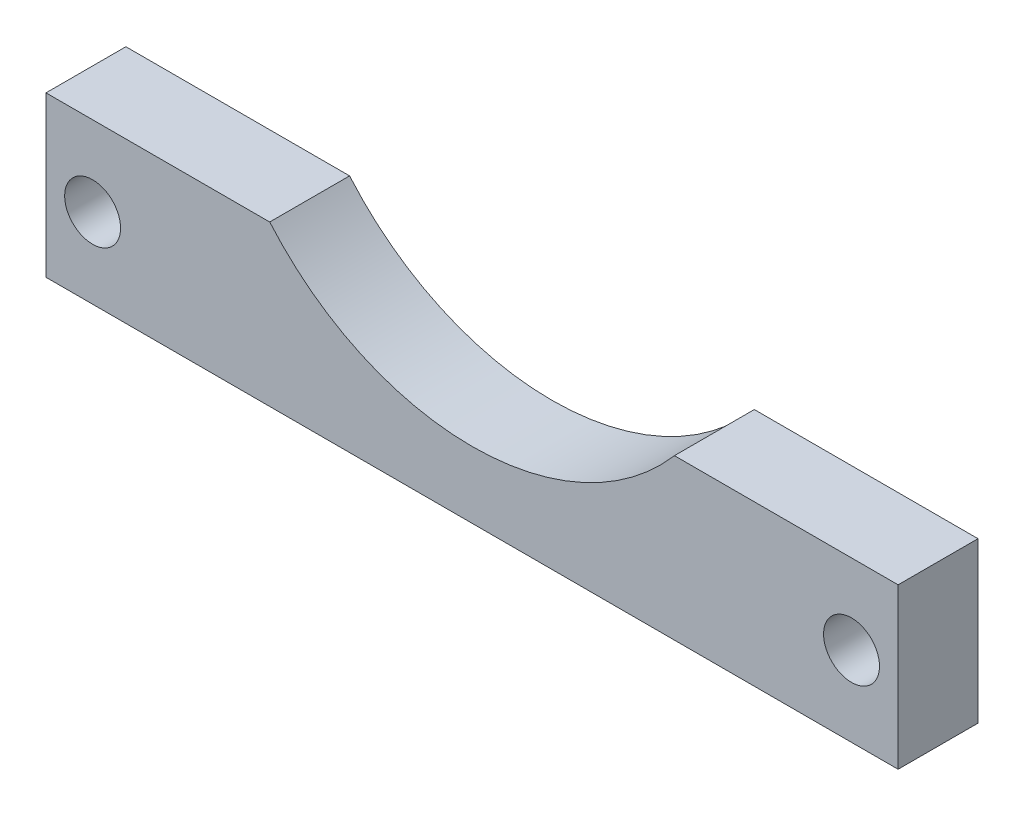
ISO-10303-21;
HEADER;
FILE_DESCRIPTION(('STEP AP214'),'2;1');
FILE_NAME('part.step','',(''),(''),'','','');
FILE_SCHEMA(('AUTOMOTIVE_DESIGN { 1 0 10303 214 1 1 1 1 }'));
ENDSEC;
DATA;
#1=APPLICATION_CONTEXT('core data for automotive mechanical design processes');
#2=APPLICATION_PROTOCOL_DEFINITION('international standard','automotive_design',2000,#1);
#3=PRODUCT_CONTEXT('',#1,'mechanical');
#4=PRODUCT('Part','Part','',(#3));
#5=PRODUCT_RELATED_PRODUCT_CATEGORY('part','',(#4));
#6=PRODUCT_DEFINITION_FORMATION('','',#4);
#7=PRODUCT_DEFINITION_CONTEXT('part definition',#1,'design');
#8=PRODUCT_DEFINITION('design','',#6,#7);
#9=PRODUCT_DEFINITION_SHAPE('','',#8);
#10=(LENGTH_UNIT() NAMED_UNIT(*) SI_UNIT(.MILLI.,.METRE.));
#11=(NAMED_UNIT(*) PLANE_ANGLE_UNIT() SI_UNIT($,.RADIAN.));
#12=(NAMED_UNIT(*) SI_UNIT($,.STERADIAN.) SOLID_ANGLE_UNIT());
#13=UNCERTAINTY_MEASURE_WITH_UNIT(LENGTH_MEASURE(1.E-05),#10,'distance_accuracy_value','');
#14=(GEOMETRIC_REPRESENTATION_CONTEXT(3) GLOBAL_UNCERTAINTY_ASSIGNED_CONTEXT((#13)) GLOBAL_UNIT_ASSIGNED_CONTEXT((#10,
#11,#12)) REPRESENTATION_CONTEXT('',''));
#15=CARTESIAN_POINT('',(0.,0.,0.));
#16=DIRECTION('',(0.,0.,1.));
#17=DIRECTION('',(1.,0.,0.));
#18=AXIS2_PLACEMENT_3D('',#15,#16,#17);
#19=CARTESIAN_POINT('',(-23.6048186104263,5.70389344262295,3.));
#20=DIRECTION('',(0.,1.,0.));
#21=DIRECTION('',(-1.,0.,0.));
#22=AXIS2_PLACEMENT_3D('',#19,#20,#21);
#23=PLANE('',#22);
#24=DIRECTION('',(1.,0.,0.));
#25=VECTOR('',#24,1.);
#26=CARTESIAN_POINT('',(-23.6048186104263,5.70389344262295,0.));
#27=LINE('',#26,#25);
#28=CARTESIAN_POINT('',(-0.00547653364095426,5.70389344262296,0.));
#29=VERTEX_POINT('',#28);
#30=CARTESIAN_POINT('',(8.3951813895737,5.70389344262296,0.));
#31=VERTEX_POINT('',#30);
#32=EDGE_CURVE('E111',#29,#31,#27,.T.);
#33=ORIENTED_EDGE('',*,*,#32,.F.);
#34=DIRECTION('',(0.,0.,-1.));
#35=VECTOR('',#34,1.);
#36=CARTESIAN_POINT('',(-0.00547653364095426,5.70389344262296,19.));
#37=LINE('',#36,#35);
#38=CARTESIAN_POINT('',(-0.00547653364095426,5.70389344262296,3.));
#39=VERTEX_POINT('',#38);
#40=EDGE_CURVE('E48',#39,#29,#37,.T.);
#41=ORIENTED_EDGE('',*,*,#40,.F.);
#42=DIRECTION('',(1.,0.,0.));
#43=VECTOR('',#42,1.);
#44=CARTESIAN_POINT('',(-23.6048186104263,5.70389344262295,3.));
#45=LINE('',#44,#43);
#46=CARTESIAN_POINT('',(8.3951813895737,5.70389344262296,3.));
#47=VERTEX_POINT('',#46);
#48=EDGE_CURVE('E135',#39,#47,#45,.T.);
#49=ORIENTED_EDGE('',*,*,#48,.T.);
#50=DIRECTION('',(0.,0.,-1.));
#51=VECTOR('',#50,1.);
#52=CARTESIAN_POINT('',(8.3951813895737,5.70389344262296,3.));
#53=LINE('',#52,#51);
#54=EDGE_CURVE('E119',#47,#31,#53,.T.);
#55=ORIENTED_EDGE('',*,*,#54,.T.);
#56=EDGE_LOOP('',(#33,#41,#49,#55));
#57=FACE_BOUND('',#56,.T.);
#58=ADVANCED_FACE('F33',(#57),#23,.T.);
#59=CARTESIAN_POINT('',(-23.6048186104263,5.70389344262295,3.));
#60=VERTEX_POINT('',#59);
#61=CARTESIAN_POINT('',(-15.2041606872116,5.70389344262295,3.));
#62=VERTEX_POINT('',#61);
#63=EDGE_CURVE('E104',#60,#62,#45,.T.);
#64=ORIENTED_EDGE('',*,*,#63,.T.);
#65=DIRECTION('',(0.,0.,-1.));
#66=VECTOR('',#65,1.);
#67=CARTESIAN_POINT('',(-15.2041606872116,5.70389344262295,19.));
#68=LINE('',#67,#66);
#69=CARTESIAN_POINT('',(-15.2041606872116,5.70389344262295,0.));
#70=VERTEX_POINT('',#69);
#71=EDGE_CURVE('E94',#62,#70,#68,.T.);
#72=ORIENTED_EDGE('',*,*,#71,.T.);
#73=CARTESIAN_POINT('',(-23.6048186104263,5.70389344262295,0.));
#74=VERTEX_POINT('',#73);
#75=EDGE_CURVE('E102',#74,#70,#27,.T.);
#76=ORIENTED_EDGE('',*,*,#75,.F.);
#77=DIRECTION('',(0.,0.,-1.));
#78=VECTOR('',#77,1.);
#79=CARTESIAN_POINT('',(-23.6048186104263,5.70389344262295,3.));
#80=LINE('',#79,#78);
#81=EDGE_CURVE('E57',#60,#74,#80,.T.);
#82=ORIENTED_EDGE('',*,*,#81,.F.);
#83=EDGE_LOOP('',(#64,#72,#76,#82));
#84=FACE_BOUND('',#83,.T.);
#85=ADVANCED_FACE('F101',(#84),#23,.T.);
#86=CARTESIAN_POINT('',(0.,0.,3.));
#87=DIRECTION('',(0.,0.,1.));
#88=DIRECTION('',(1.,0.,0.));
#89=AXIS2_PLACEMENT_3D('',#86,#87,#88);
#90=PLANE('',#89);
#91=CARTESIAN_POINT('',(6.64518138957371,2.70389344262296,3.));
#92=DIRECTION('',(0.,0.,1.));
#93=DIRECTION('',(1.,0.,0.));
#94=AXIS2_PLACEMENT_3D('',#91,#92,#93);
#95=CIRCLE('',#94,1.05);
#96=CARTESIAN_POINT('',(7.69518138957371,2.70389344262296,3.));
#97=VERTEX_POINT('',#96);
#98=EDGE_CURVE('E145',#97,#97,#95,.F.);
#99=ORIENTED_EDGE('',*,*,#98,.T.);
#100=EDGE_LOOP('',(#99));
#101=FACE_BOUND('',#100,.T.);
#102=ORIENTED_EDGE('',*,*,#48,.F.);
#103=CARTESIAN_POINT('',(-7.60481861042629,12.203893442623,3.));
#104=DIRECTION('',(0.,0.,1.));
#105=DIRECTION('',(1.,0.,0.));
#106=AXIS2_PLACEMENT_3D('',#103,#104,#105);
#107=CIRCLE('',#106,10.);
#108=EDGE_CURVE('E105',#39,#62,#107,.F.);
#109=ORIENTED_EDGE('',*,*,#108,.T.);
#110=ORIENTED_EDGE('',*,*,#63,.F.);
#111=DIRECTION('',(0.,-1.,0.));
#112=VECTOR('',#111,1.);
#113=CARTESIAN_POINT('',(-23.6048186104263,5.70389344262295,3.));
#114=LINE('',#113,#112);
#115=CARTESIAN_POINT('',(-23.6048186104263,-0.296106557377048,3.));
#116=VERTEX_POINT('',#115);
#117=EDGE_CURVE('E110',#60,#116,#114,.T.);
#118=ORIENTED_EDGE('',*,*,#117,.T.);
#119=DIRECTION('',(1.,0.,0.));
#120=VECTOR('',#119,1.);
#121=CARTESIAN_POINT('',(-23.6048186104263,-0.296106557377048,3.));
#122=LINE('',#121,#120);
#123=CARTESIAN_POINT('',(8.39518138957371,-0.296106557377044,3.));
#124=VERTEX_POINT('',#123);
#125=EDGE_CURVE('E83',#116,#124,#122,.T.);
#126=ORIENTED_EDGE('',*,*,#125,.T.);
#127=DIRECTION('',(0.,-1.,0.));
#128=VECTOR('',#127,1.);
#129=CARTESIAN_POINT('',(8.3951813895737,5.70389344262296,3.));
#130=LINE('',#129,#128);
#131=EDGE_CURVE('E129',#47,#124,#130,.T.);
#132=ORIENTED_EDGE('',*,*,#131,.F.);
#133=EDGE_LOOP('',(#102,#109,#110,#118,#126,#132));
#134=FACE_BOUND('',#133,.T.);
#135=CARTESIAN_POINT('',(-21.8548186104263,2.70389344262295,3.));
#136=DIRECTION('',(0.,0.,1.));
#137=DIRECTION('',(1.,0.,0.));
#138=AXIS2_PLACEMENT_3D('',#135,#136,#137);
#139=CIRCLE('',#138,1.05);
#140=CARTESIAN_POINT('',(-20.8048186104263,2.70389344262295,3.));
#141=VERTEX_POINT('',#140);
#142=EDGE_CURVE('E143',#141,#141,#139,.T.);
#143=ORIENTED_EDGE('',*,*,#142,.F.);
#144=EDGE_LOOP('',(#143));
#145=FACE_BOUND('',#144,.T.);
#146=ADVANCED_FACE('F137',(#101,#134,#145),#90,.T.);
#147=CARTESIAN_POINT('',(0.,0.,0.));
#148=DIRECTION('',(0.,0.,1.));
#149=DIRECTION('',(1.,0.,0.));
#150=AXIS2_PLACEMENT_3D('',#147,#148,#149);
#151=PLANE('',#150);
#152=CARTESIAN_POINT('',(-7.60481861042629,12.203893442623,0.));
#153=DIRECTION('',(0.,0.,1.));
#154=DIRECTION('',(1.,0.,0.));
#155=AXIS2_PLACEMENT_3D('',#152,#153,#154);
#156=CIRCLE('',#155,10.);
#157=EDGE_CURVE('E91',#70,#29,#156,.T.);
#158=ORIENTED_EDGE('',*,*,#157,.T.);
#159=ORIENTED_EDGE('',*,*,#32,.T.);
#160=DIRECTION('',(0.,-1.,0.));
#161=VECTOR('',#160,1.);
#162=CARTESIAN_POINT('',(8.3951813895737,5.70389344262296,0.));
#163=LINE('',#162,#161);
#164=CARTESIAN_POINT('',(8.39518138957371,-0.296106557377044,0.));
#165=VERTEX_POINT('',#164);
#166=EDGE_CURVE('E114',#31,#165,#163,.T.);
#167=ORIENTED_EDGE('',*,*,#166,.T.);
#168=DIRECTION('',(1.,0.,0.));
#169=VECTOR('',#168,1.);
#170=CARTESIAN_POINT('',(-23.6048186104263,-0.296106557377048,0.));
#171=LINE('',#170,#169);
#172=CARTESIAN_POINT('',(-23.6048186104263,-0.296106557377048,0.));
#173=VERTEX_POINT('',#172);
#174=EDGE_CURVE('E130',#173,#165,#171,.T.);
#175=ORIENTED_EDGE('',*,*,#174,.F.);
#176=DIRECTION('',(0.,-1.,0.));
#177=VECTOR('',#176,1.);
#178=CARTESIAN_POINT('',(-23.6048186104263,5.70389344262295,0.));
#179=LINE('',#178,#177);
#180=EDGE_CURVE('E109',#74,#173,#179,.T.);
#181=ORIENTED_EDGE('',*,*,#180,.F.);
#182=ORIENTED_EDGE('',*,*,#75,.T.);
#183=EDGE_LOOP('',(#158,#159,#167,#175,#181,#182));
#184=FACE_BOUND('',#183,.T.);
#185=CARTESIAN_POINT('',(6.64518138957371,2.70389344262296,0.));
#186=DIRECTION('',(0.,0.,1.));
#187=DIRECTION('',(1.,0.,0.));
#188=AXIS2_PLACEMENT_3D('',#185,#186,#187);
#189=CIRCLE('',#188,1.05);
#190=CARTESIAN_POINT('',(7.69518138957371,2.70389344262296,0.));
#191=VERTEX_POINT('',#190);
#192=EDGE_CURVE('E99',#191,#191,#189,.T.);
#193=ORIENTED_EDGE('',*,*,#192,.T.);
#194=EDGE_LOOP('',(#193));
#195=FACE_BOUND('',#194,.T.);
#196=CARTESIAN_POINT('',(-21.8548186104263,2.70389344262295,0.));
#197=DIRECTION('',(0.,0.,-1.));
#198=DIRECTION('',(-1.,0.,0.));
#199=AXIS2_PLACEMENT_3D('',#196,#197,#198);
#200=CIRCLE('',#199,1.05);
#201=CARTESIAN_POINT('',(-22.9048186104263,2.70389344262295,0.));
#202=VERTEX_POINT('',#201);
#203=EDGE_CURVE('E154',#202,#202,#200,.T.);
#204=ORIENTED_EDGE('',*,*,#203,.F.);
#205=EDGE_LOOP('',(#204));
#206=FACE_BOUND('',#205,.T.);
#207=ADVANCED_FACE('F107',(#184,#195,#206),#151,.F.);
#208=CARTESIAN_POINT('',(-23.6048186104263,5.70389344262295,3.));
#209=DIRECTION('',(1.,0.,0.));
#210=DIRECTION('',(0.,0.,-1.));
#211=AXIS2_PLACEMENT_3D('',#208,#209,#210);
#212=PLANE('',#211);
#213=ORIENTED_EDGE('',*,*,#180,.T.);
#214=DIRECTION('',(0.,0.,-1.));
#215=VECTOR('',#214,1.);
#216=CARTESIAN_POINT('',(-23.6048186104263,-0.296106557377048,3.));
#217=LINE('',#216,#215);
#218=EDGE_CURVE('E11',#116,#173,#217,.T.);
#219=ORIENTED_EDGE('',*,*,#218,.F.);
#220=ORIENTED_EDGE('',*,*,#117,.F.);
#221=ORIENTED_EDGE('',*,*,#81,.T.);
#222=EDGE_LOOP('',(#213,#219,#220,#221));
#223=FACE_BOUND('',#222,.T.);
#224=ADVANCED_FACE('F35',(#223),#212,.F.);
#225=CARTESIAN_POINT('',(-23.6048186104263,-0.296106557377048,3.));
#226=DIRECTION('',(0.,1.,0.));
#227=DIRECTION('',(-1.,0.,0.));
#228=AXIS2_PLACEMENT_3D('',#225,#226,#227);
#229=PLANE('',#228);
#230=ORIENTED_EDGE('',*,*,#174,.T.);
#231=DIRECTION('',(0.,0.,-1.));
#232=VECTOR('',#231,1.);
#233=CARTESIAN_POINT('',(8.39518138957371,-0.296106557377044,3.));
#234=LINE('',#233,#232);
#235=EDGE_CURVE('E41',#124,#165,#234,.T.);
#236=ORIENTED_EDGE('',*,*,#235,.F.);
#237=ORIENTED_EDGE('',*,*,#125,.F.);
#238=ORIENTED_EDGE('',*,*,#218,.T.);
#239=EDGE_LOOP('',(#230,#236,#237,#238));
#240=FACE_BOUND('',#239,.T.);
#241=ADVANCED_FACE('F131',(#240),#229,.F.);
#242=CARTESIAN_POINT('',(8.3951813895737,5.70389344262296,3.));
#243=DIRECTION('',(1.,0.,0.));
#244=DIRECTION('',(0.,1.,0.));
#245=AXIS2_PLACEMENT_3D('',#242,#243,#244);
#246=PLANE('',#245);
#247=ORIENTED_EDGE('',*,*,#166,.F.);
#248=ORIENTED_EDGE('',*,*,#54,.F.);
#249=ORIENTED_EDGE('',*,*,#131,.T.);
#250=ORIENTED_EDGE('',*,*,#235,.T.);
#251=EDGE_LOOP('',(#247,#248,#249,#250));
#252=FACE_BOUND('',#251,.T.);
#253=ADVANCED_FACE('F125',(#252),#246,.T.);
#254=CARTESIAN_POINT('',(-7.60481861042629,12.203893442623,19.));
#255=DIRECTION('',(0.,0.,-1.));
#256=DIRECTION('',(-1.,0.,0.));
#257=AXIS2_PLACEMENT_3D('',#254,#255,#256);
#258=CYLINDRICAL_SURFACE('',#257,10.);
#259=ORIENTED_EDGE('',*,*,#40,.T.);
#260=ORIENTED_EDGE('',*,*,#157,.F.);
#261=ORIENTED_EDGE('',*,*,#71,.F.);
#262=ORIENTED_EDGE('',*,*,#108,.F.);
#263=EDGE_LOOP('',(#259,#260,#261,#262));
#264=FACE_BOUND('',#263,.T.);
#265=ADVANCED_FACE('F93',(#264),#258,.F.);
#266=CARTESIAN_POINT('',(6.64518138957371,2.70389344262296,19.));
#267=DIRECTION('',(0.,0.,-1.));
#268=DIRECTION('',(-1.,0.,0.));
#269=AXIS2_PLACEMENT_3D('',#266,#267,#268);
#270=CYLINDRICAL_SURFACE('',#269,1.05);
#271=ORIENTED_EDGE('',*,*,#98,.F.);
#272=EDGE_LOOP('',(#271));
#273=FACE_BOUND('',#272,.T.);
#274=ORIENTED_EDGE('',*,*,#192,.F.);
#275=EDGE_LOOP('',(#274));
#276=FACE_BOUND('',#275,.T.);
#277=ADVANCED_FACE('F161',(#273,#276),#270,.F.);
#278=CARTESIAN_POINT('',(-21.8548186104263,2.70389344262295,19.));
#279=DIRECTION('',(0.,0.,-1.));
#280=DIRECTION('',(-1.,0.,0.));
#281=AXIS2_PLACEMENT_3D('',#278,#279,#280);
#282=CYLINDRICAL_SURFACE('',#281,1.05);
#283=ORIENTED_EDGE('',*,*,#142,.T.);
#284=EDGE_LOOP('',(#283));
#285=FACE_BOUND('',#284,.T.);
#286=ORIENTED_EDGE('',*,*,#203,.T.);
#287=EDGE_LOOP('',(#286));
#288=FACE_BOUND('',#287,.T.);
#289=ADVANCED_FACE('F163',(#285,#288),#282,.F.);
#290=CLOSED_SHELL('',(#58,#85,#146,#207,#224,#241,#253,#265,#277,#289));
#291=MANIFOLD_SOLID_BREP('B2',#290);
#292=ADVANCED_BREP_SHAPE_REPRESENTATION('',(#18,#291),#14);
#293=SHAPE_DEFINITION_REPRESENTATION(#9,#292);
ENDSEC;
END-ISO-10303-21;
